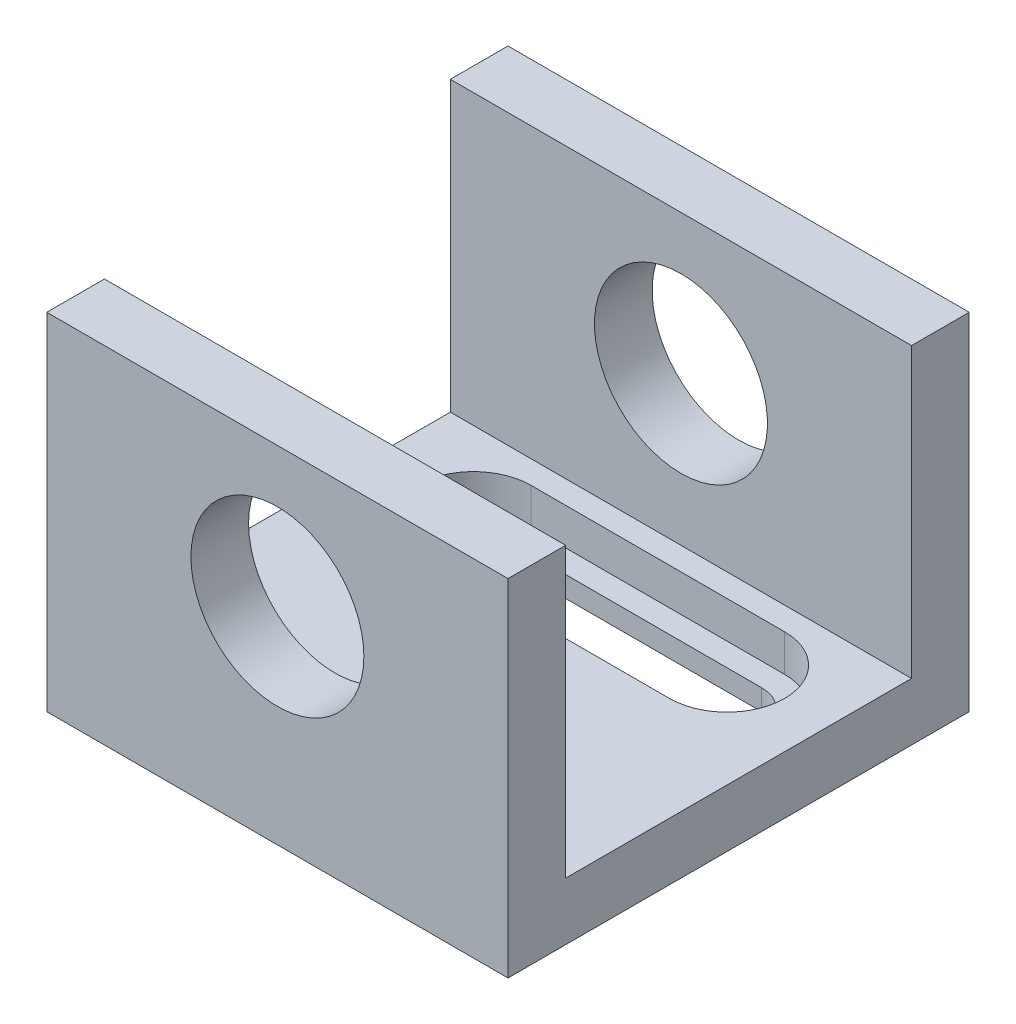
ISO-10303-21;
HEADER;
FILE_DESCRIPTION(('STEP AP214'),'2;1');
FILE_NAME('part.step','',(''),(''),'','','');
FILE_SCHEMA(('AUTOMOTIVE_DESIGN { 1 0 10303 214 1 1 1 1 }'));
ENDSEC;
DATA;
#1=APPLICATION_CONTEXT('core data for automotive mechanical design processes');
#2=APPLICATION_PROTOCOL_DEFINITION('international standard','automotive_design',2000,#1);
#3=PRODUCT_CONTEXT('',#1,'mechanical');
#4=PRODUCT('Part','Part','',(#3));
#5=PRODUCT_RELATED_PRODUCT_CATEGORY('part','',(#4));
#6=PRODUCT_DEFINITION_FORMATION('','',#4);
#7=PRODUCT_DEFINITION_CONTEXT('part definition',#1,'design');
#8=PRODUCT_DEFINITION('design','',#6,#7);
#9=PRODUCT_DEFINITION_SHAPE('','',#8);
#10=(LENGTH_UNIT() NAMED_UNIT(*) SI_UNIT(.MILLI.,.METRE.));
#11=(NAMED_UNIT(*) PLANE_ANGLE_UNIT() SI_UNIT($,.RADIAN.));
#12=(NAMED_UNIT(*) SI_UNIT($,.STERADIAN.) SOLID_ANGLE_UNIT());
#13=UNCERTAINTY_MEASURE_WITH_UNIT(LENGTH_MEASURE(1.E-05),#10,'distance_accuracy_value','');
#14=(GEOMETRIC_REPRESENTATION_CONTEXT(3) GLOBAL_UNCERTAINTY_ASSIGNED_CONTEXT((#13)) GLOBAL_UNIT_ASSIGNED_CONTEXT((#10,
#11,#12)) REPRESENTATION_CONTEXT('',''));
#15=CARTESIAN_POINT('',(0.,0.,0.));
#16=DIRECTION('',(0.,0.,1.));
#17=DIRECTION('',(1.,0.,0.));
#18=AXIS2_PLACEMENT_3D('',#15,#16,#17);
#19=CARTESIAN_POINT('',(-29.4308975786814,-62.865,4.44499999999999));
#20=DIRECTION('',(0.,1.,0.));
#21=DIRECTION('',(-1.,0.,0.));
#22=AXIS2_PLACEMENT_3D('',#19,#20,#21);
#23=CYLINDRICAL_SURFACE('',#22,1.905);
#24=CARTESIAN_POINT('',(-29.4308975786814,1.14300000000001,4.445));
#25=DIRECTION('',(0.,1.,0.));
#26=DIRECTION('',(-1.,0.,0.));
#27=AXIS2_PLACEMENT_3D('',#24,#25,#26);
#28=CIRCLE('',#27,1.905);
#29=CARTESIAN_POINT('',(-29.4308975786814,1.14300000000001,6.35));
#30=VERTEX_POINT('',#29);
#31=CARTESIAN_POINT('',(-29.4308975786814,1.14300000000001,2.54));
#32=VERTEX_POINT('',#31);
#33=EDGE_CURVE('E188',#30,#32,#28,.F.);
#34=ORIENTED_EDGE('',*,*,#33,.F.);
#35=DIRECTION('',(0.,1.,0.));
#36=VECTOR('',#35,1.);
#37=CARTESIAN_POINT('',(-29.4308975786814,-62.865,6.34999999999999));
#38=LINE('',#37,#36);
#39=CARTESIAN_POINT('',(-29.4308975786814,0.,6.35));
#40=VERTEX_POINT('',#39);
#41=EDGE_CURVE('E190',#40,#30,#38,.T.);
#42=ORIENTED_EDGE('',*,*,#41,.F.);
#43=CARTESIAN_POINT('',(-29.4308975786814,0.,4.445));
#44=DIRECTION('',(0.,1.,0.));
#45=DIRECTION('',(-1.,0.,0.));
#46=AXIS2_PLACEMENT_3D('',#43,#44,#45);
#47=CIRCLE('',#46,1.905);
#48=CARTESIAN_POINT('',(-29.4308975786814,0.,2.54));
#49=VERTEX_POINT('',#48);
#50=EDGE_CURVE('E43',#49,#40,#47,.T.);
#51=ORIENTED_EDGE('',*,*,#50,.F.);
#52=DIRECTION('',(0.,1.,0.));
#53=VECTOR('',#52,1.);
#54=CARTESIAN_POINT('',(-29.4308975786814,-62.865,2.53999999999999));
#55=LINE('',#54,#53);
#56=EDGE_CURVE('E191',#49,#32,#55,.T.);
#57=ORIENTED_EDGE('',*,*,#56,.T.);
#58=EDGE_LOOP('',(#34,#42,#51,#57));
#59=FACE_BOUND('',#58,.T.);
#60=ADVANCED_FACE('F35',(#59),#23,.F.);
#61=CARTESIAN_POINT('',(-29.4308975786814,-62.865,2.53999999999999));
#62=DIRECTION('',(0.,0.,1.));
#63=DIRECTION('',(0.,-1.,0.));
#64=AXIS2_PLACEMENT_3D('',#61,#62,#63);
#65=PLANE('',#64);
#66=DIRECTION('',(0.,1.,0.));
#67=VECTOR('',#66,1.);
#68=CARTESIAN_POINT('',(-15.4608975786814,-62.865,2.53999999999999));
#69=LINE('',#68,#67);
#70=CARTESIAN_POINT('',(-15.4608975786814,0.,2.54));
#71=VERTEX_POINT('',#70);
#72=CARTESIAN_POINT('',(-15.4608975786814,1.14300000000001,2.54));
#73=VERTEX_POINT('',#72);
#74=EDGE_CURVE('E195',#71,#73,#69,.T.);
#75=ORIENTED_EDGE('',*,*,#74,.T.);
#76=DIRECTION('',(-1.,0.,0.));
#77=VECTOR('',#76,1.);
#78=CARTESIAN_POINT('',(-29.4308975786814,1.14300000000001,2.54));
#79=LINE('',#78,#77);
#80=EDGE_CURVE('E185',#73,#32,#79,.T.);
#81=ORIENTED_EDGE('',*,*,#80,.T.);
#82=ORIENTED_EDGE('',*,*,#56,.F.);
#83=DIRECTION('',(1.,0.,0.));
#84=VECTOR('',#83,1.);
#85=CARTESIAN_POINT('',(-9.74589757868136,0.,2.54));
#86=LINE('',#85,#84);
#87=EDGE_CURVE('E279',#49,#71,#86,.T.);
#88=ORIENTED_EDGE('',*,*,#87,.T.);
#89=EDGE_LOOP('',(#75,#81,#82,#88));
#90=FACE_BOUND('',#89,.T.);
#91=ADVANCED_FACE('F291',(#90),#65,.T.);
#92=CARTESIAN_POINT('',(-15.4608975786814,-62.865,4.44499999999999));
#93=DIRECTION('',(0.,1.,0.));
#94=DIRECTION('',(-1.,0.,0.));
#95=AXIS2_PLACEMENT_3D('',#92,#93,#94);
#96=CYLINDRICAL_SURFACE('',#95,1.905);
#97=DIRECTION('',(0.,1.,0.));
#98=VECTOR('',#97,1.);
#99=CARTESIAN_POINT('',(-15.4608975786814,-62.865,6.34999999999999));
#100=LINE('',#99,#98);
#101=CARTESIAN_POINT('',(-15.4608975786814,0.,6.35));
#102=VERTEX_POINT('',#101);
#103=CARTESIAN_POINT('',(-15.4608975786814,1.14300000000001,6.35));
#104=VERTEX_POINT('',#103);
#105=EDGE_CURVE('E198',#102,#104,#100,.T.);
#106=ORIENTED_EDGE('',*,*,#105,.T.);
#107=CARTESIAN_POINT('',(-15.4608975786814,1.14300000000001,4.445));
#108=DIRECTION('',(0.,1.,0.));
#109=DIRECTION('',(-1.,0.,0.));
#110=AXIS2_PLACEMENT_3D('',#107,#108,#109);
#111=CIRCLE('',#110,1.905);
#112=EDGE_CURVE('E57',#104,#73,#111,.T.);
#113=ORIENTED_EDGE('',*,*,#112,.T.);
#114=ORIENTED_EDGE('',*,*,#74,.F.);
#115=CARTESIAN_POINT('',(-15.4608975786814,0.,4.445));
#116=DIRECTION('',(0.,1.,0.));
#117=DIRECTION('',(-1.,0.,0.));
#118=AXIS2_PLACEMENT_3D('',#115,#116,#117);
#119=CIRCLE('',#118,1.905);
#120=EDGE_CURVE('E276',#71,#102,#119,.F.);
#121=ORIENTED_EDGE('',*,*,#120,.T.);
#122=EDGE_LOOP('',(#106,#113,#114,#121));
#123=FACE_BOUND('',#122,.T.);
#124=ADVANCED_FACE('F294',(#123),#96,.F.);
#125=CARTESIAN_POINT('',(-29.4308975786814,-62.865,6.34999999999999));
#126=DIRECTION('',(0.,0.,1.));
#127=DIRECTION('',(0.,-1.,0.));
#128=AXIS2_PLACEMENT_3D('',#125,#126,#127);
#129=PLANE('',#128);
#130=DIRECTION('',(-1.,0.,0.));
#131=VECTOR('',#130,1.);
#132=CARTESIAN_POINT('',(-29.4308975786814,1.14300000000001,6.35));
#133=LINE('',#132,#131);
#134=EDGE_CURVE('E11',#104,#30,#133,.T.);
#135=ORIENTED_EDGE('',*,*,#134,.F.);
#136=ORIENTED_EDGE('',*,*,#105,.F.);
#137=DIRECTION('',(1.,0.,0.));
#138=VECTOR('',#137,1.);
#139=CARTESIAN_POINT('',(-9.74589757868136,0.,6.35));
#140=LINE('',#139,#138);
#141=EDGE_CURVE('E271',#40,#102,#140,.T.);
#142=ORIENTED_EDGE('',*,*,#141,.F.);
#143=ORIENTED_EDGE('',*,*,#41,.T.);
#144=EDGE_LOOP('',(#135,#136,#142,#143));
#145=FACE_BOUND('',#144,.T.);
#146=ADVANCED_FACE('F296',(#145),#129,.F.);
#147=CARTESIAN_POINT('',(-9.74589757868135,19.05,-3.175));
#148=DIRECTION('',(0.,0.,1.));
#149=DIRECTION('',(0.,-1.,0.));
#150=AXIS2_PLACEMENT_3D('',#147,#148,#149);
#151=PLANE('',#150);
#152=CARTESIAN_POINT('',(-22.4458975786814,11.3665,-3.175));
#153=DIRECTION('',(0.,0.,-1.));
#154=DIRECTION('',(0.,1.,0.));
#155=AXIS2_PLACEMENT_3D('',#152,#153,#154);
#156=CIRCLE('',#155,4.7625);
#157=CARTESIAN_POINT('',(-22.4458975786814,16.129,-3.175));
#158=VERTEX_POINT('',#157);
#159=EDGE_CURVE('E194',#158,#158,#156,.T.);
#160=ORIENTED_EDGE('',*,*,#159,.F.);
#161=EDGE_LOOP('',(#160));
#162=FACE_BOUND('',#161,.T.);
#163=DIRECTION('',(0.,1.,0.));
#164=VECTOR('',#163,1.);
#165=CARTESIAN_POINT('',(-35.1458975786813,19.05,-3.175));
#166=LINE('',#165,#164);
#167=CARTESIAN_POINT('',(-35.1458975786814,0.,-3.175));
#168=VERTEX_POINT('',#167);
#169=CARTESIAN_POINT('',(-35.1458975786813,19.05,-3.175));
#170=VERTEX_POINT('',#169);
#171=EDGE_CURVE('E212',#168,#170,#166,.T.);
#172=ORIENTED_EDGE('',*,*,#171,.T.);
#173=DIRECTION('',(-1.,0.,0.));
#174=VECTOR('',#173,1.);
#175=CARTESIAN_POINT('',(-9.74589757868135,19.05,-3.175));
#176=LINE('',#175,#174);
#177=CARTESIAN_POINT('',(-9.74589757868135,19.05,-3.175));
#178=VERTEX_POINT('',#177);
#179=EDGE_CURVE('E265',#178,#170,#176,.T.);
#180=ORIENTED_EDGE('',*,*,#179,.F.);
#181=DIRECTION('',(0.,1.,0.));
#182=VECTOR('',#181,1.);
#183=CARTESIAN_POINT('',(-9.74589757868135,19.05,-3.175));
#184=LINE('',#183,#182);
#185=CARTESIAN_POINT('',(-9.74589757868136,0.,-3.175));
#186=VERTEX_POINT('',#185);
#187=EDGE_CURVE('E216',#186,#178,#184,.T.);
#188=ORIENTED_EDGE('',*,*,#187,.F.);
#189=DIRECTION('',(-1.,0.,0.));
#190=VECTOR('',#189,1.);
#191=CARTESIAN_POINT('',(-9.74589757868136,0.,-3.175));
#192=LINE('',#191,#190);
#193=EDGE_CURVE('E268',#186,#168,#192,.T.);
#194=ORIENTED_EDGE('',*,*,#193,.T.);
#195=EDGE_LOOP('',(#172,#180,#188,#194));
#196=FACE_BOUND('',#195,.T.);
#197=ADVANCED_FACE('F37',(#162,#196),#151,.F.);
#198=CARTESIAN_POINT('',(-9.74589757868135,19.05,-3.175));
#199=DIRECTION('',(0.,-1.,0.));
#200=DIRECTION('',(1.,0.,0.));
#201=AXIS2_PLACEMENT_3D('',#198,#199,#200);
#202=PLANE('',#201);
#203=DIRECTION('',(0.,0.,1.));
#204=VECTOR('',#203,1.);
#205=CARTESIAN_POINT('',(-35.1458975786813,19.05,-3.175));
#206=LINE('',#205,#204);
#207=CARTESIAN_POINT('',(-35.1458975786813,19.05,0.));
#208=VERTEX_POINT('',#207);
#209=EDGE_CURVE('E234',#170,#208,#206,.T.);
#210=ORIENTED_EDGE('',*,*,#209,.T.);
#211=DIRECTION('',(-1.,0.,0.));
#212=VECTOR('',#211,1.);
#213=CARTESIAN_POINT('',(-9.74589757868135,19.05,0.));
#214=LINE('',#213,#212);
#215=CARTESIAN_POINT('',(-9.74589757868135,19.05,0.));
#216=VERTEX_POINT('',#215);
#217=EDGE_CURVE('E262',#216,#208,#214,.T.);
#218=ORIENTED_EDGE('',*,*,#217,.F.);
#219=DIRECTION('',(0.,0.,1.));
#220=VECTOR('',#219,1.);
#221=CARTESIAN_POINT('',(-9.74589757868135,19.05,-3.175));
#222=LINE('',#221,#220);
#223=EDGE_CURVE('E219',#178,#216,#222,.T.);
#224=ORIENTED_EDGE('',*,*,#223,.F.);
#225=ORIENTED_EDGE('',*,*,#179,.T.);
#226=EDGE_LOOP('',(#210,#218,#224,#225));
#227=FACE_BOUND('',#226,.T.);
#228=ADVANCED_FACE('F303',(#227),#202,.F.);
#229=CARTESIAN_POINT('',(-9.74589757868135,19.05,0.));
#230=DIRECTION('',(0.,0.,-1.));
#231=DIRECTION('',(0.,1.,0.));
#232=AXIS2_PLACEMENT_3D('',#229,#230,#231);
#233=PLANE('',#232);
#234=CARTESIAN_POINT('',(-22.4458975786814,11.3665,0.));
#235=DIRECTION('',(0.,0.,-1.));
#236=DIRECTION('',(0.,1.,0.));
#237=AXIS2_PLACEMENT_3D('',#234,#235,#236);
#238=CIRCLE('',#237,4.7625);
#239=CARTESIAN_POINT('',(-22.4458975786814,16.129,0.));
#240=VERTEX_POINT('',#239);
#241=EDGE_CURVE('E209',#240,#240,#238,.T.);
#242=ORIENTED_EDGE('',*,*,#241,.T.);
#243=EDGE_LOOP('',(#242));
#244=FACE_BOUND('',#243,.T.);
#245=DIRECTION('',(0.,-1.,0.));
#246=VECTOR('',#245,1.);
#247=CARTESIAN_POINT('',(-35.1458975786813,19.05,0.));
#248=LINE('',#247,#246);
#249=CARTESIAN_POINT('',(-35.1458975786814,3.17500000000001,0.));
#250=VERTEX_POINT('',#249);
#251=EDGE_CURVE('E236',#208,#250,#248,.T.);
#252=ORIENTED_EDGE('',*,*,#251,.T.);
#253=DIRECTION('',(-1.,0.,0.));
#254=VECTOR('',#253,1.);
#255=CARTESIAN_POINT('',(-9.74589757868136,3.175,0.));
#256=LINE('',#255,#254);
#257=CARTESIAN_POINT('',(-9.74589757868136,3.175,0.));
#258=VERTEX_POINT('',#257);
#259=EDGE_CURVE('E259',#258,#250,#256,.T.);
#260=ORIENTED_EDGE('',*,*,#259,.F.);
#261=DIRECTION('',(0.,-1.,0.));
#262=VECTOR('',#261,1.);
#263=CARTESIAN_POINT('',(-9.74589757868135,19.05,0.));
#264=LINE('',#263,#262);
#265=EDGE_CURVE('E221',#216,#258,#264,.T.);
#266=ORIENTED_EDGE('',*,*,#265,.F.);
#267=ORIENTED_EDGE('',*,*,#217,.T.);
#268=EDGE_LOOP('',(#252,#260,#266,#267));
#269=FACE_BOUND('',#268,.T.);
#270=ADVANCED_FACE('F343',(#244,#269),#233,.F.);
#271=CARTESIAN_POINT('',(-9.74589757868136,3.175,0.));
#272=DIRECTION('',(0.,-1.,0.));
#273=DIRECTION('',(1.,0.,0.));
#274=AXIS2_PLACEMENT_3D('',#271,#272,#273);
#275=PLANE('',#274);
#276=DIRECTION('',(1.,0.,0.));
#277=VECTOR('',#276,1.);
#278=CARTESIAN_POINT('',(-29.4308975786814,3.17500000000001,7.62));
#279=LINE('',#278,#277);
#280=CARTESIAN_POINT('',(-29.4308975786814,3.17500000000001,7.62));
#281=VERTEX_POINT('',#280);
#282=CARTESIAN_POINT('',(-15.4608975786814,3.17500000000001,7.62));
#283=VERTEX_POINT('',#282);
#284=EDGE_CURVE('E175',#281,#283,#279,.T.);
#285=ORIENTED_EDGE('',*,*,#284,.F.);
#286=CARTESIAN_POINT('',(-29.4308975786814,3.17500000000001,4.445));
#287=DIRECTION('',(0.,1.,0.));
#288=DIRECTION('',(-1.,0.,0.));
#289=AXIS2_PLACEMENT_3D('',#286,#287,#288);
#290=CIRCLE('',#289,3.175);
#291=CARTESIAN_POINT('',(-29.4308975786814,3.17500000000001,1.27));
#292=VERTEX_POINT('',#291);
#293=EDGE_CURVE('E50',#292,#281,#290,.T.);
#294=ORIENTED_EDGE('',*,*,#293,.F.);
#295=DIRECTION('',(1.,0.,0.));
#296=VECTOR('',#295,1.);
#297=CARTESIAN_POINT('',(-29.4308975786814,3.17500000000001,1.27));
#298=LINE('',#297,#296);
#299=CARTESIAN_POINT('',(-15.4608975786814,3.17500000000001,1.27));
#300=VERTEX_POINT('',#299);
#301=EDGE_CURVE('E166',#292,#300,#298,.T.);
#302=ORIENTED_EDGE('',*,*,#301,.T.);
#303=CARTESIAN_POINT('',(-15.4608975786814,3.17500000000001,4.445));
#304=DIRECTION('',(0.,-1.,0.));
#305=DIRECTION('',(1.,0.,0.));
#306=AXIS2_PLACEMENT_3D('',#303,#304,#305);
#307=CIRCLE('',#306,3.175);
#308=EDGE_CURVE('E169',#300,#283,#307,.T.);
#309=ORIENTED_EDGE('',*,*,#308,.T.);
#310=EDGE_LOOP('',(#285,#294,#302,#309));
#311=FACE_BOUND('',#310,.T.);
#312=DIRECTION('',(0.,0.,1.));
#313=VECTOR('',#312,1.);
#314=CARTESIAN_POINT('',(-35.1458975786814,3.17500000000001,0.));
#315=LINE('',#314,#313);
#316=CARTESIAN_POINT('',(-35.1458975786814,3.17500000000001,19.05));
#317=VERTEX_POINT('',#316);
#318=EDGE_CURVE('E238',#250,#317,#315,.T.);
#319=ORIENTED_EDGE('',*,*,#318,.T.);
#320=DIRECTION('',(-1.,0.,0.));
#321=VECTOR('',#320,1.);
#322=CARTESIAN_POINT('',(-9.74589757868136,3.175,19.05));
#323=LINE('',#322,#321);
#324=CARTESIAN_POINT('',(-9.74589757868136,3.175,19.05));
#325=VERTEX_POINT('',#324);
#326=EDGE_CURVE('E256',#325,#317,#323,.T.);
#327=ORIENTED_EDGE('',*,*,#326,.F.);
#328=DIRECTION('',(0.,0.,1.));
#329=VECTOR('',#328,1.);
#330=CARTESIAN_POINT('',(-9.74589757868136,3.175,0.));
#331=LINE('',#330,#329);
#332=EDGE_CURVE('E223',#258,#325,#331,.T.);
#333=ORIENTED_EDGE('',*,*,#332,.F.);
#334=ORIENTED_EDGE('',*,*,#259,.T.);
#335=EDGE_LOOP('',(#319,#327,#333,#334));
#336=FACE_BOUND('',#335,.T.);
#337=ADVANCED_FACE('F339',(#311,#336),#275,.F.);
#338=CARTESIAN_POINT('',(-9.74589757868136,3.175,19.05));
#339=DIRECTION('',(0.,0.,1.));
#340=DIRECTION('',(1.,0.,0.));
#341=AXIS2_PLACEMENT_3D('',#338,#339,#340);
#342=PLANE('',#341);
#343=CARTESIAN_POINT('',(-22.4458975786814,11.3665,19.05));
#344=DIRECTION('',(0.,0.,1.));
#345=DIRECTION('',(1.,0.,0.));
#346=AXIS2_PLACEMENT_3D('',#343,#344,#345);
#347=CIRCLE('',#346,4.7625);
#348=CARTESIAN_POINT('',(-17.6833975786814,11.3665,19.05));
#349=VERTEX_POINT('',#348);
#350=EDGE_CURVE('E206',#349,#349,#347,.T.);
#351=ORIENTED_EDGE('',*,*,#350,.T.);
#352=EDGE_LOOP('',(#351));
#353=FACE_BOUND('',#352,.T.);
#354=DIRECTION('',(0.,1.,0.));
#355=VECTOR('',#354,1.);
#356=CARTESIAN_POINT('',(-35.1458975786814,3.17500000000001,19.05));
#357=LINE('',#356,#355);
#358=CARTESIAN_POINT('',(-35.1458975786813,19.05,19.05));
#359=VERTEX_POINT('',#358);
#360=EDGE_CURVE('E240',#317,#359,#357,.T.);
#361=ORIENTED_EDGE('',*,*,#360,.T.);
#362=DIRECTION('',(-1.,0.,0.));
#363=VECTOR('',#362,1.);
#364=CARTESIAN_POINT('',(-9.74589757868135,19.05,19.05));
#365=LINE('',#364,#363);
#366=CARTESIAN_POINT('',(-9.74589757868135,19.05,19.05));
#367=VERTEX_POINT('',#366);
#368=EDGE_CURVE('E253',#367,#359,#365,.T.);
#369=ORIENTED_EDGE('',*,*,#368,.F.);
#370=DIRECTION('',(0.,1.,0.));
#371=VECTOR('',#370,1.);
#372=CARTESIAN_POINT('',(-9.74589757868136,3.175,19.05));
#373=LINE('',#372,#371);
#374=EDGE_CURVE('E225',#325,#367,#373,.T.);
#375=ORIENTED_EDGE('',*,*,#374,.F.);
#376=ORIENTED_EDGE('',*,*,#326,.T.);
#377=EDGE_LOOP('',(#361,#369,#375,#376));
#378=FACE_BOUND('',#377,.T.);
#379=ADVANCED_FACE('F335',(#353,#378),#342,.F.);
#380=CARTESIAN_POINT('',(-9.74589757868135,19.05,19.05));
#381=DIRECTION('',(0.,-1.,0.));
#382=DIRECTION('',(1.,0.,0.));
#383=AXIS2_PLACEMENT_3D('',#380,#381,#382);
#384=PLANE('',#383);
#385=DIRECTION('',(0.,0.,1.));
#386=VECTOR('',#385,1.);
#387=CARTESIAN_POINT('',(-35.1458975786813,19.05,19.05));
#388=LINE('',#387,#386);
#389=CARTESIAN_POINT('',(-35.1458975786813,19.05,22.225));
#390=VERTEX_POINT('',#389);
#391=EDGE_CURVE('E242',#359,#390,#388,.T.);
#392=ORIENTED_EDGE('',*,*,#391,.T.);
#393=DIRECTION('',(-1.,0.,0.));
#394=VECTOR('',#393,1.);
#395=CARTESIAN_POINT('',(-9.74589757868135,19.05,22.225));
#396=LINE('',#395,#394);
#397=CARTESIAN_POINT('',(-9.74589757868135,19.05,22.225));
#398=VERTEX_POINT('',#397);
#399=EDGE_CURVE('E250',#398,#390,#396,.T.);
#400=ORIENTED_EDGE('',*,*,#399,.F.);
#401=DIRECTION('',(0.,0.,1.));
#402=VECTOR('',#401,1.);
#403=CARTESIAN_POINT('',(-9.74589757868135,19.05,19.05));
#404=LINE('',#403,#402);
#405=EDGE_CURVE('E227',#367,#398,#404,.T.);
#406=ORIENTED_EDGE('',*,*,#405,.F.);
#407=ORIENTED_EDGE('',*,*,#368,.T.);
#408=EDGE_LOOP('',(#392,#400,#406,#407));
#409=FACE_BOUND('',#408,.T.);
#410=ADVANCED_FACE('F331',(#409),#384,.F.);
#411=CARTESIAN_POINT('',(-9.74589757868136,0.,22.225));
#412=DIRECTION('',(0.,0.,-1.));
#413=DIRECTION('',(-1.,0.,0.));
#414=AXIS2_PLACEMENT_3D('',#411,#412,#413);
#415=PLANE('',#414);
#416=CARTESIAN_POINT('',(-22.4458975786814,11.3665,22.225));
#417=DIRECTION('',(0.,0.,-1.));
#418=DIRECTION('',(-1.,0.,0.));
#419=AXIS2_PLACEMENT_3D('',#416,#417,#418);
#420=CIRCLE('',#419,4.7625);
#421=CARTESIAN_POINT('',(-27.2083975786814,11.3665,22.225));
#422=VERTEX_POINT('',#421);
#423=EDGE_CURVE('E205',#422,#422,#420,.T.);
#424=ORIENTED_EDGE('',*,*,#423,.T.);
#425=EDGE_LOOP('',(#424));
#426=FACE_BOUND('',#425,.T.);
#427=DIRECTION('',(0.,-1.,0.));
#428=VECTOR('',#427,1.);
#429=CARTESIAN_POINT('',(-35.1458975786814,0.,22.225));
#430=LINE('',#429,#428);
#431=CARTESIAN_POINT('',(-35.1458975786814,0.,22.225));
#432=VERTEX_POINT('',#431);
#433=EDGE_CURVE('E244',#390,#432,#430,.T.);
#434=ORIENTED_EDGE('',*,*,#433,.T.);
#435=DIRECTION('',(-1.,0.,0.));
#436=VECTOR('',#435,1.);
#437=CARTESIAN_POINT('',(-9.74589757868136,0.,22.225));
#438=LINE('',#437,#436);
#439=CARTESIAN_POINT('',(-9.74589757868136,0.,22.225));
#440=VERTEX_POINT('',#439);
#441=EDGE_CURVE('E232',#440,#432,#438,.T.);
#442=ORIENTED_EDGE('',*,*,#441,.F.);
#443=DIRECTION('',(0.,-1.,0.));
#444=VECTOR('',#443,1.);
#445=CARTESIAN_POINT('',(-9.74589757868136,0.,22.225));
#446=LINE('',#445,#444);
#447=EDGE_CURVE('E229',#398,#440,#446,.T.);
#448=ORIENTED_EDGE('',*,*,#447,.F.);
#449=ORIENTED_EDGE('',*,*,#399,.T.);
#450=EDGE_LOOP('',(#434,#442,#448,#449));
#451=FACE_BOUND('',#450,.T.);
#452=ADVANCED_FACE('F328',(#426,#451),#415,.F.);
#453=CARTESIAN_POINT('',(-9.74589757868136,0.,0.));
#454=DIRECTION('',(0.,1.,0.));
#455=DIRECTION('',(-1.,0.,0.));
#456=AXIS2_PLACEMENT_3D('',#453,#454,#455);
#457=PLANE('',#456);
#458=ORIENTED_EDGE('',*,*,#87,.F.);
#459=ORIENTED_EDGE('',*,*,#50,.T.);
#460=ORIENTED_EDGE('',*,*,#141,.T.);
#461=ORIENTED_EDGE('',*,*,#120,.F.);
#462=EDGE_LOOP('',(#458,#459,#460,#461));
#463=FACE_BOUND('',#462,.T.);
#464=DIRECTION('',(0.,0.,-1.));
#465=VECTOR('',#464,1.);
#466=CARTESIAN_POINT('',(-35.1458975786814,0.,0.));
#467=LINE('',#466,#465);
#468=EDGE_CURVE('E217',#432,#168,#467,.T.);
#469=ORIENTED_EDGE('',*,*,#468,.T.);
#470=ORIENTED_EDGE('',*,*,#193,.F.);
#471=DIRECTION('',(0.,0.,-1.));
#472=VECTOR('',#471,1.);
#473=CARTESIAN_POINT('',(-9.74589757868136,0.,-3.175));
#474=LINE('',#473,#472);
#475=EDGE_CURVE('E213',#440,#186,#474,.T.);
#476=ORIENTED_EDGE('',*,*,#475,.F.);
#477=ORIENTED_EDGE('',*,*,#441,.T.);
#478=EDGE_LOOP('',(#469,#470,#476,#477));
#479=FACE_BOUND('',#478,.T.);
#480=ADVANCED_FACE('F283',(#463,#479),#457,.F.);
#481=CARTESIAN_POINT('',(-9.74589757868136,0.,0.));
#482=DIRECTION('',(-1.,0.,0.));
#483=DIRECTION('',(0.,-1.,0.));
#484=AXIS2_PLACEMENT_3D('',#481,#482,#483);
#485=PLANE('',#484);
#486=ORIENTED_EDGE('',*,*,#475,.T.);
#487=ORIENTED_EDGE('',*,*,#187,.T.);
#488=ORIENTED_EDGE('',*,*,#223,.T.);
#489=ORIENTED_EDGE('',*,*,#265,.T.);
#490=ORIENTED_EDGE('',*,*,#332,.T.);
#491=ORIENTED_EDGE('',*,*,#374,.T.);
#492=ORIENTED_EDGE('',*,*,#405,.T.);
#493=ORIENTED_EDGE('',*,*,#447,.T.);
#494=EDGE_LOOP('',(#486,#487,#488,#489,#490,#491,#492,#493));
#495=FACE_BOUND('',#494,.T.);
#496=ADVANCED_FACE('F318',(#495),#485,.F.);
#497=CARTESIAN_POINT('',(-35.1458975786814,0.,0.));
#498=DIRECTION('',(-1.,0.,0.));
#499=DIRECTION('',(0.,-1.,0.));
#500=AXIS2_PLACEMENT_3D('',#497,#498,#499);
#501=PLANE('',#500);
#502=ORIENTED_EDGE('',*,*,#171,.F.);
#503=ORIENTED_EDGE('',*,*,#468,.F.);
#504=ORIENTED_EDGE('',*,*,#433,.F.);
#505=ORIENTED_EDGE('',*,*,#391,.F.);
#506=ORIENTED_EDGE('',*,*,#360,.F.);
#507=ORIENTED_EDGE('',*,*,#318,.F.);
#508=ORIENTED_EDGE('',*,*,#251,.F.);
#509=ORIENTED_EDGE('',*,*,#209,.F.);
#510=EDGE_LOOP('',(#502,#503,#504,#505,#506,#507,#508,#509));
#511=FACE_BOUND('',#510,.T.);
#512=ADVANCED_FACE('F321',(#511),#501,.T.);
#513=CARTESIAN_POINT('',(-22.4458975786814,11.3665,33.401));
#514=DIRECTION('',(0.,0.,-1.));
#515=DIRECTION('',(0.,1.,0.));
#516=AXIS2_PLACEMENT_3D('',#513,#514,#515);
#517=CYLINDRICAL_SURFACE('',#516,4.7625);
#518=ORIENTED_EDGE('',*,*,#423,.F.);
#519=EDGE_LOOP('',(#518));
#520=FACE_BOUND('',#519,.T.);
#521=ORIENTED_EDGE('',*,*,#350,.F.);
#522=EDGE_LOOP('',(#521));
#523=FACE_BOUND('',#522,.T.);
#524=ADVANCED_FACE('F316',(#520,#523),#517,.F.);
#525=ORIENTED_EDGE('',*,*,#159,.T.);
#526=EDGE_LOOP('',(#525));
#527=FACE_BOUND('',#526,.T.);
#528=ORIENTED_EDGE('',*,*,#241,.F.);
#529=EDGE_LOOP('',(#528));
#530=FACE_BOUND('',#529,.T.);
#531=ADVANCED_FACE('F313',(#527,#530),#517,.F.);
#532=CARTESIAN_POINT('',(-29.4308975786814,1.14300000000001,4.445));
#533=DIRECTION('',(0.,1.,0.));
#534=DIRECTION('',(-1.,0.,0.));
#535=AXIS2_PLACEMENT_3D('',#532,#533,#534);
#536=PLANE('',#535);
#537=CARTESIAN_POINT('',(-29.4308975786814,1.14300000000001,4.445));
#538=DIRECTION('',(0.,1.,0.));
#539=DIRECTION('',(-1.,0.,0.));
#540=AXIS2_PLACEMENT_3D('',#537,#538,#539);
#541=CIRCLE('',#540,3.175);
#542=CARTESIAN_POINT('',(-29.4308975786814,1.14300000000001,1.27));
#543=VERTEX_POINT('',#542);
#544=CARTESIAN_POINT('',(-29.4308975786814,1.14300000000001,7.62));
#545=VERTEX_POINT('',#544);
#546=EDGE_CURVE('E149',#543,#545,#541,.T.);
#547=ORIENTED_EDGE('',*,*,#546,.T.);
#548=DIRECTION('',(1.,0.,0.));
#549=VECTOR('',#548,1.);
#550=CARTESIAN_POINT('',(-29.4308975786814,1.14300000000001,7.62));
#551=LINE('',#550,#549);
#552=CARTESIAN_POINT('',(-15.4608975786814,1.14300000000001,7.62));
#553=VERTEX_POINT('',#552);
#554=EDGE_CURVE('E158',#545,#553,#551,.T.);
#555=ORIENTED_EDGE('',*,*,#554,.T.);
#556=CARTESIAN_POINT('',(-15.4608975786814,1.14300000000001,4.445));
#557=DIRECTION('',(0.,-1.,0.));
#558=DIRECTION('',(1.,0.,0.));
#559=AXIS2_PLACEMENT_3D('',#556,#557,#558);
#560=CIRCLE('',#559,3.175);
#561=CARTESIAN_POINT('',(-15.4608975786814,1.14300000000001,1.27));
#562=VERTEX_POINT('',#561);
#563=EDGE_CURVE('E162',#562,#553,#560,.T.);
#564=ORIENTED_EDGE('',*,*,#563,.F.);
#565=DIRECTION('',(1.,0.,0.));
#566=VECTOR('',#565,1.);
#567=CARTESIAN_POINT('',(-29.4308975786814,1.14300000000001,1.27));
#568=LINE('',#567,#566);
#569=EDGE_CURVE('E154',#543,#562,#568,.T.);
#570=ORIENTED_EDGE('',*,*,#569,.F.);
#571=EDGE_LOOP('',(#547,#555,#564,#570));
#572=FACE_BOUND('',#571,.T.);
#573=ORIENTED_EDGE('',*,*,#33,.T.);
#574=ORIENTED_EDGE('',*,*,#80,.F.);
#575=ORIENTED_EDGE('',*,*,#112,.F.);
#576=ORIENTED_EDGE('',*,*,#134,.T.);
#577=EDGE_LOOP('',(#573,#574,#575,#576));
#578=FACE_BOUND('',#577,.T.);
#579=ADVANCED_FACE('F165',(#572,#578),#536,.T.);
#580=CARTESIAN_POINT('',(-29.4308975786814,1.14300000000001,4.445));
#581=DIRECTION('',(0.,1.,0.));
#582=DIRECTION('',(-1.,0.,0.));
#583=AXIS2_PLACEMENT_3D('',#580,#581,#582);
#584=CYLINDRICAL_SURFACE('',#583,3.175);
#585=ORIENTED_EDGE('',*,*,#293,.T.);
#586=DIRECTION('',(0.,1.,0.));
#587=VECTOR('',#586,1.);
#588=CARTESIAN_POINT('',(-29.4308975786814,1.14300000000001,7.62));
#589=LINE('',#588,#587);
#590=EDGE_CURVE('E145',#545,#281,#589,.T.);
#591=ORIENTED_EDGE('',*,*,#590,.F.);
#592=ORIENTED_EDGE('',*,*,#546,.F.);
#593=DIRECTION('',(0.,1.,0.));
#594=VECTOR('',#593,1.);
#595=CARTESIAN_POINT('',(-29.4308975786814,1.14300000000001,1.27));
#596=LINE('',#595,#594);
#597=EDGE_CURVE('E179',#543,#292,#596,.T.);
#598=ORIENTED_EDGE('',*,*,#597,.T.);
#599=EDGE_LOOP('',(#585,#591,#592,#598));
#600=FACE_BOUND('',#599,.T.);
#601=ADVANCED_FACE('F147',(#600),#584,.F.);
#602=CARTESIAN_POINT('',(-29.4308975786814,1.14300000000001,1.27));
#603=DIRECTION('',(0.,0.,1.));
#604=DIRECTION('',(0.,-1.,0.));
#605=AXIS2_PLACEMENT_3D('',#602,#603,#604);
#606=PLANE('',#605);
#607=ORIENTED_EDGE('',*,*,#301,.F.);
#608=ORIENTED_EDGE('',*,*,#597,.F.);
#609=ORIENTED_EDGE('',*,*,#569,.T.);
#610=DIRECTION('',(0.,1.,0.));
#611=VECTOR('',#610,1.);
#612=CARTESIAN_POINT('',(-15.4608975786814,1.14300000000001,1.27));
#613=LINE('',#612,#611);
#614=EDGE_CURVE('E181',#562,#300,#613,.T.);
#615=ORIENTED_EDGE('',*,*,#614,.T.);
#616=EDGE_LOOP('',(#607,#608,#609,#615));
#617=FACE_BOUND('',#616,.T.);
#618=ADVANCED_FACE('F433',(#617),#606,.T.);
#619=CARTESIAN_POINT('',(-15.4608975786814,1.14300000000001,4.445));
#620=DIRECTION('',(0.,1.,0.));
#621=DIRECTION('',(-1.,0.,0.));
#622=AXIS2_PLACEMENT_3D('',#619,#620,#621);
#623=CYLINDRICAL_SURFACE('',#622,3.175);
#624=ORIENTED_EDGE('',*,*,#308,.F.);
#625=ORIENTED_EDGE('',*,*,#614,.F.);
#626=ORIENTED_EDGE('',*,*,#563,.T.);
#627=DIRECTION('',(0.,1.,0.));
#628=VECTOR('',#627,1.);
#629=CARTESIAN_POINT('',(-15.4608975786814,1.14300000000001,7.62));
#630=LINE('',#629,#628);
#631=EDGE_CURVE('E153',#553,#283,#630,.T.);
#632=ORIENTED_EDGE('',*,*,#631,.T.);
#633=EDGE_LOOP('',(#624,#625,#626,#632));
#634=FACE_BOUND('',#633,.T.);
#635=ADVANCED_FACE('F440',(#634),#623,.F.);
#636=CARTESIAN_POINT('',(-29.4308975786814,1.14300000000001,7.62));
#637=DIRECTION('',(0.,0.,1.));
#638=DIRECTION('',(0.,-1.,0.));
#639=AXIS2_PLACEMENT_3D('',#636,#637,#638);
#640=PLANE('',#639);
#641=ORIENTED_EDGE('',*,*,#284,.T.);
#642=ORIENTED_EDGE('',*,*,#631,.F.);
#643=ORIENTED_EDGE('',*,*,#554,.F.);
#644=ORIENTED_EDGE('',*,*,#590,.T.);
#645=EDGE_LOOP('',(#641,#642,#643,#644));
#646=FACE_BOUND('',#645,.T.);
#647=ADVANCED_FACE('F159',(#646),#640,.F.);
#648=CLOSED_SHELL('',(#60,#91,#124,#146,#197,#228,#270,#337,#379,#410,#452,#480,#496,#512,#524,
#531,#579,#601,#618,#635,#647));
#649=MANIFOLD_SOLID_BREP('B2',#648);
#650=ADVANCED_BREP_SHAPE_REPRESENTATION('',(#18,#649),#14);
#651=SHAPE_DEFINITION_REPRESENTATION(#9,#650);
ENDSEC;
END-ISO-10303-21;
